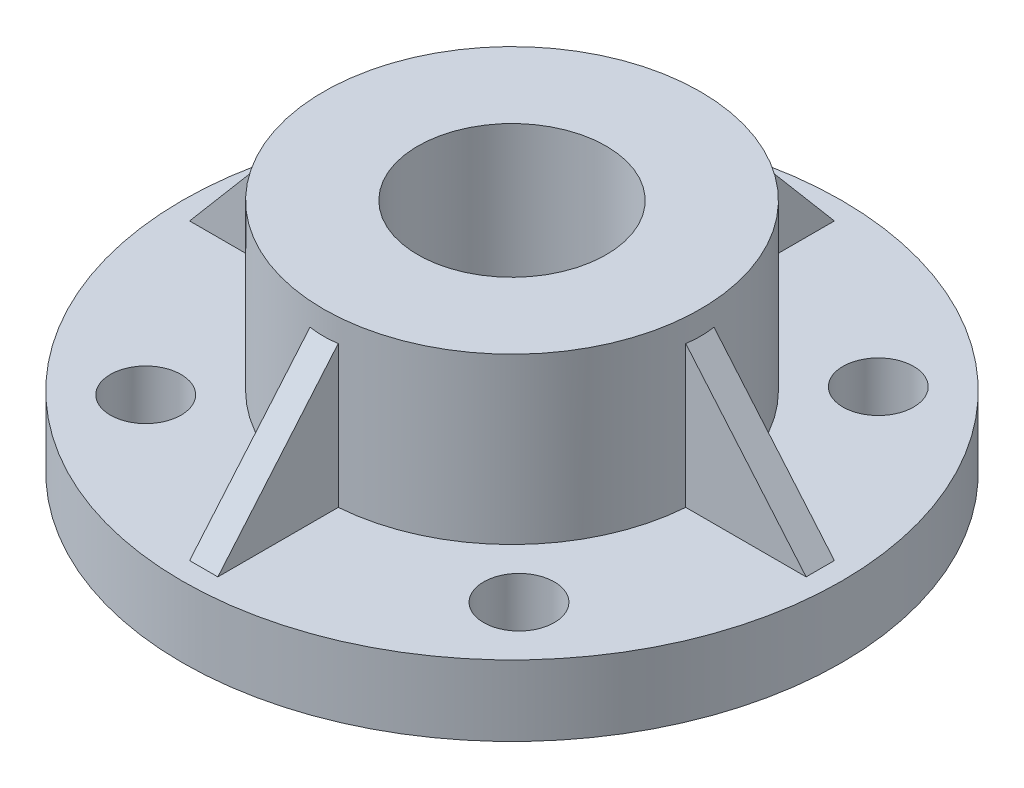
ISO-10303-21;
HEADER;
FILE_DESCRIPTION(('STEP AP214'),'2;1');
FILE_NAME('part.step','',(''),(''),'','','');
FILE_SCHEMA(('AUTOMOTIVE_DESIGN { 1 0 10303 214 1 1 1 1 }'));
ENDSEC;
DATA;
#1=APPLICATION_CONTEXT('core data for automotive mechanical design processes');
#2=APPLICATION_PROTOCOL_DEFINITION('international standard','automotive_design',2000,#1);
#3=PRODUCT_CONTEXT('',#1,'mechanical');
#4=PRODUCT('Part','Part','',(#3));
#5=PRODUCT_RELATED_PRODUCT_CATEGORY('part','',(#4));
#6=PRODUCT_DEFINITION_FORMATION('','',#4);
#7=PRODUCT_DEFINITION_CONTEXT('part definition',#1,'design');
#8=PRODUCT_DEFINITION('design','',#6,#7);
#9=PRODUCT_DEFINITION_SHAPE('','',#8);
#10=(LENGTH_UNIT() NAMED_UNIT(*) SI_UNIT(.MILLI.,.METRE.));
#11=(NAMED_UNIT(*) PLANE_ANGLE_UNIT() SI_UNIT($,.RADIAN.));
#12=(NAMED_UNIT(*) SI_UNIT($,.STERADIAN.) SOLID_ANGLE_UNIT());
#13=UNCERTAINTY_MEASURE_WITH_UNIT(LENGTH_MEASURE(1.E-05),#10,'distance_accuracy_value','');
#14=(GEOMETRIC_REPRESENTATION_CONTEXT(3) GLOBAL_UNCERTAINTY_ASSIGNED_CONTEXT((#13)) GLOBAL_UNIT_ASSIGNED_CONTEXT((#10,
#11,#12)) REPRESENTATION_CONTEXT('',''));
#15=CARTESIAN_POINT('',(0.,0.,0.));
#16=DIRECTION('',(0.,0.,1.));
#17=DIRECTION('',(1.,0.,0.));
#18=AXIS2_PLACEMENT_3D('',#15,#16,#17);
#19=CARTESIAN_POINT('',(20.,49.0897895819615,0.));
#20=DIRECTION('',(0.,1.,0.));
#21=DIRECTION('',(0.,0.,1.));
#22=AXIS2_PLACEMENT_3D('',#19,#20,#21);
#23=PLANE('',#22);
#24=CARTESIAN_POINT('',(0.,49.0897895819615,0.));
#25=DIRECTION('',(0.,-1.,0.));
#26=DIRECTION('',(0.,0.,-1.));
#27=AXIS2_PLACEMENT_3D('',#24,#25,#26);
#28=CIRCLE('',#27,20.);
#29=CARTESIAN_POINT('',(0.,49.0897895819615,-20.));
#30=VERTEX_POINT('',#29);
#31=EDGE_CURVE('E285',#30,#30,#28,.T.);
#32=ORIENTED_EDGE('',*,*,#31,.T.);
#33=EDGE_LOOP('',(#32));
#34=FACE_BOUND('',#33,.T.);
#35=CARTESIAN_POINT('',(0.,49.0897895819615,0.));
#36=DIRECTION('',(0.,-1.,0.));
#37=DIRECTION('',(0.,0.,-1.));
#38=AXIS2_PLACEMENT_3D('',#35,#36,#37);
#39=CIRCLE('',#38,40.);
#40=CARTESIAN_POINT('',(0.,49.0897895819615,-40.));
#41=VERTEX_POINT('',#40);
#42=EDGE_CURVE('E13',#41,#41,#39,.T.);
#43=ORIENTED_EDGE('',*,*,#42,.F.);
#44=EDGE_LOOP('',(#43));
#45=FACE_BOUND('',#44,.T.);
#46=ADVANCED_FACE('F53',(#34,#45),#23,.T.);
#47=CARTESIAN_POINT('',(0.,0.,0.));
#48=DIRECTION('',(0.,-1.,0.));
#49=DIRECTION('',(0.,0.,-1.));
#50=AXIS2_PLACEMENT_3D('',#47,#48,#49);
#51=CYLINDRICAL_SURFACE('',#50,40.);
#52=DIRECTION('',(0.,-1.,0.));
#53=VECTOR('',#52,1.);
#54=CARTESIAN_POINT('',(3.00000000000014,0.,-39.8873413503583));
#55=LINE('',#54,#53);
#56=CARTESIAN_POINT('',(3.00000000000014,14.0897895819615,-39.8873413503583));
#57=VERTEX_POINT('',#56);
#58=CARTESIAN_POINT('',(3.00000000000014,44.2225973757126,-39.8873413503583));
#59=VERTEX_POINT('',#58);
#60=EDGE_CURVE('E221',#57,#59,#55,.F.);
#61=ORIENTED_EDGE('',*,*,#60,.T.);
#62=CARTESIAN_POINT('',(0.,91.2438409303383,0.));
#63=DIRECTION('',(0.,-0.646888134461805,0.762584907726691));
#64=DIRECTION('',(0.,-0.762584907726691,-0.646888134461805));
#65=AXIS2_PLACEMENT_3D('',#62,#63,#64);
#66=ELLIPSE('',#65,61.8344932749138,40.);
#67=CARTESIAN_POINT('',(-2.99999999999986,44.2225973757126,-39.8873413503583));
#68=VERTEX_POINT('',#67);
#69=EDGE_CURVE('E234',#68,#59,#66,.T.);
#70=ORIENTED_EDGE('',*,*,#69,.F.);
#71=DIRECTION('',(0.,-1.,0.));
#72=VECTOR('',#71,1.);
#73=CARTESIAN_POINT('',(-2.99999999999986,0.,-39.8873413503583));
#74=LINE('',#73,#72);
#75=CARTESIAN_POINT('',(-2.99999999999986,14.0897895819615,-39.8873413503583));
#76=VERTEX_POINT('',#75);
#77=EDGE_CURVE('E228',#76,#68,#74,.F.);
#78=ORIENTED_EDGE('',*,*,#77,.F.);
#79=CARTESIAN_POINT('',(0.,14.0897895819615,0.));
#80=DIRECTION('',(0.,-1.,0.));
#81=DIRECTION('',(0.,0.,-1.));
#82=AXIS2_PLACEMENT_3D('',#79,#80,#81);
#83=CIRCLE('',#82,40.);
#84=CARTESIAN_POINT('',(-39.8873413503583,14.0897895819615,-3.));
#85=VERTEX_POINT('',#84);
#86=EDGE_CURVE('E62',#85,#76,#83,.T.);
#87=ORIENTED_EDGE('',*,*,#86,.F.);
#88=DIRECTION('',(0.,-1.,0.));
#89=VECTOR('',#88,1.);
#90=CARTESIAN_POINT('',(-39.8873413503583,0.,-3.));
#91=LINE('',#90,#89);
#92=CARTESIAN_POINT('',(-39.8873413503583,44.2225973757126,-3.));
#93=VERTEX_POINT('',#92);
#94=EDGE_CURVE('E268',#85,#93,#91,.F.);
#95=ORIENTED_EDGE('',*,*,#94,.T.);
#96=CARTESIAN_POINT('',(0.,91.2438409303383,0.));
#97=DIRECTION('',(0.762584907726691,-0.646888134461805,0.));
#98=DIRECTION('',(-0.646888134461805,-0.762584907726691,0.));
#99=AXIS2_PLACEMENT_3D('',#96,#97,#98);
#100=ELLIPSE('',#99,61.8344932749138,40.);
#101=CARTESIAN_POINT('',(-39.8873413503583,44.2225973757126,3.));
#102=VERTEX_POINT('',#101);
#103=EDGE_CURVE('E282',#102,#93,#100,.T.);
#104=ORIENTED_EDGE('',*,*,#103,.F.);
#105=DIRECTION('',(0.,-1.,0.));
#106=VECTOR('',#105,1.);
#107=CARTESIAN_POINT('',(-39.8873413503583,0.,3.));
#108=LINE('',#107,#106);
#109=CARTESIAN_POINT('',(-39.8873413503583,14.0897895819615,3.));
#110=VERTEX_POINT('',#109);
#111=EDGE_CURVE('E276',#110,#102,#108,.F.);
#112=ORIENTED_EDGE('',*,*,#111,.F.);
#113=CARTESIAN_POINT('',(-3.00000000000042,14.0897895819615,39.8873413503583));
#114=VERTEX_POINT('',#113);
#115=EDGE_CURVE('E301',#114,#110,#83,.T.);
#116=ORIENTED_EDGE('',*,*,#115,.F.);
#117=DIRECTION('',(0.,-1.,0.));
#118=VECTOR('',#117,1.);
#119=CARTESIAN_POINT('',(-3.00000000000042,0.,39.8873413503582));
#120=LINE('',#119,#118);
#121=CARTESIAN_POINT('',(-3.00000000000042,44.2225973757126,39.8873413503582));
#122=VERTEX_POINT('',#121);
#123=EDGE_CURVE('E70',#114,#122,#120,.F.);
#124=ORIENTED_EDGE('',*,*,#123,.T.);
#125=CARTESIAN_POINT('',(0.,91.2438409303383,0.));
#126=DIRECTION('',(0.,-0.646888134461805,-0.762584907726691));
#127=DIRECTION('',(0.,-0.762584907726691,0.646888134461805));
#128=AXIS2_PLACEMENT_3D('',#125,#126,#127);
#129=ELLIPSE('',#128,61.8344932749138,40.);
#130=CARTESIAN_POINT('',(2.99999999999958,44.2225973757126,39.8873413503583));
#131=VERTEX_POINT('',#130);
#132=EDGE_CURVE('E156',#131,#122,#129,.T.);
#133=ORIENTED_EDGE('',*,*,#132,.F.);
#134=DIRECTION('',(0.,-1.,0.));
#135=VECTOR('',#134,1.);
#136=CARTESIAN_POINT('',(2.99999999999958,0.,39.8873413503583));
#137=LINE('',#136,#135);
#138=CARTESIAN_POINT('',(2.99999999999959,14.0897895819615,39.8873413503583));
#139=VERTEX_POINT('',#138);
#140=EDGE_CURVE('E162',#139,#131,#137,.F.);
#141=ORIENTED_EDGE('',*,*,#140,.F.);
#142=CARTESIAN_POINT('',(39.8873413503583,14.0897895819615,3.));
#143=VERTEX_POINT('',#142);
#144=EDGE_CURVE('E170',#143,#139,#83,.T.);
#145=ORIENTED_EDGE('',*,*,#144,.F.);
#146=DIRECTION('',(0.,-1.,0.));
#147=VECTOR('',#146,1.);
#148=CARTESIAN_POINT('',(39.8873413503583,0.,3.));
#149=LINE('',#148,#147);
#150=CARTESIAN_POINT('',(39.8873413503583,44.2225973757126,3.));
#151=VERTEX_POINT('',#150);
#152=EDGE_CURVE('E78',#143,#151,#149,.F.);
#153=ORIENTED_EDGE('',*,*,#152,.T.);
#154=CARTESIAN_POINT('',(0.,91.2438409303383,0.));
#155=DIRECTION('',(-0.762584907726691,-0.646888134461805,0.));
#156=DIRECTION('',(0.646888134461805,-0.762584907726691,0.));
#157=AXIS2_PLACEMENT_3D('',#154,#155,#156);
#158=ELLIPSE('',#157,61.8344932749138,40.);
#159=CARTESIAN_POINT('',(39.8873413503583,44.2225973757126,-3.));
#160=VERTEX_POINT('',#159);
#161=EDGE_CURVE('E206',#160,#151,#158,.T.);
#162=ORIENTED_EDGE('',*,*,#161,.F.);
#163=DIRECTION('',(0.,-1.,0.));
#164=VECTOR('',#163,1.);
#165=CARTESIAN_POINT('',(39.8873413503583,0.,-3.));
#166=LINE('',#165,#164);
#167=CARTESIAN_POINT('',(39.8873413503583,14.0897895819615,-3.));
#168=VERTEX_POINT('',#167);
#169=EDGE_CURVE('E195',#168,#160,#166,.F.);
#170=ORIENTED_EDGE('',*,*,#169,.F.);
#171=EDGE_CURVE('E304',#57,#168,#83,.T.);
#172=ORIENTED_EDGE('',*,*,#171,.F.);
#173=EDGE_LOOP('',(#61,#70,#78,#87,#95,#104,#112,#116,#124,#133,#141,#145,#153,#162,#170,#172));
#174=FACE_BOUND('',#173,.T.);
#175=ORIENTED_EDGE('',*,*,#42,.T.);
#176=EDGE_LOOP('',(#175));
#177=FACE_BOUND('',#176,.T.);
#178=ADVANCED_FACE('F348',(#174,#177),#51,.T.);
#179=CARTESIAN_POINT('',(40.,14.0897895819615,0.));
#180=DIRECTION('',(0.,1.,0.));
#181=DIRECTION('',(0.,0.,1.));
#182=AXIS2_PLACEMENT_3D('',#179,#180,#181);
#183=PLANE('',#182);
#184=CARTESIAN_POINT('',(0.,14.0897895819615,0.));
#185=DIRECTION('',(0.,-1.,0.));
#186=DIRECTION('',(0.,0.,-1.));
#187=AXIS2_PLACEMENT_3D('',#184,#185,#186);
#188=CIRCLE('',#187,70.);
#189=CARTESIAN_POINT('',(0.,14.0897895819615,-70.));
#190=VERTEX_POINT('',#189);
#191=EDGE_CURVE('E297',#190,#190,#188,.T.);
#192=ORIENTED_EDGE('',*,*,#191,.F.);
#193=EDGE_LOOP('',(#192));
#194=FACE_BOUND('',#193,.T.);
#195=DIRECTION('',(1.,0.,0.));
#196=VECTOR('',#195,1.);
#197=CARTESIAN_POINT('',(40.0000000000003,14.0897895819615,-65.44850263521));
#198=LINE('',#197,#196);
#199=CARTESIAN_POINT('',(3.00000000000023,14.0897895819615,-65.4485026352101));
#200=VERTEX_POINT('',#199);
#201=CARTESIAN_POINT('',(-2.99999999999977,14.0897895819615,-65.4485026352101));
#202=VERTEX_POINT('',#201);
#203=EDGE_CURVE('E231',#200,#202,#198,.F.);
#204=ORIENTED_EDGE('',*,*,#203,.F.);
#205=DIRECTION('',(0.,0.,1.));
#206=VECTOR('',#205,1.);
#207=CARTESIAN_POINT('',(3.,14.0897895819615,-1.29184809537196E-13));
#208=LINE('',#207,#206);
#209=EDGE_CURVE('E214',#200,#57,#208,.T.);
#210=ORIENTED_EDGE('',*,*,#209,.T.);
#211=ORIENTED_EDGE('',*,*,#171,.T.);
#212=DIRECTION('',(-1.,0.,0.));
#213=VECTOR('',#212,1.);
#214=CARTESIAN_POINT('',(40.,14.0897895819615,-3.));
#215=LINE('',#214,#213);
#216=CARTESIAN_POINT('',(65.4485026352101,14.0897895819615,-3.));
#217=VERTEX_POINT('',#216);
#218=EDGE_CURVE('E190',#217,#168,#215,.T.);
#219=ORIENTED_EDGE('',*,*,#218,.F.);
#220=DIRECTION('',(0.,0.,1.));
#221=VECTOR('',#220,1.);
#222=CARTESIAN_POINT('',(65.4485026352101,14.0897895819615,0.));
#223=LINE('',#222,#221);
#224=CARTESIAN_POINT('',(65.4485026352101,14.0897895819615,3.));
#225=VERTEX_POINT('',#224);
#226=EDGE_CURVE('E203',#225,#217,#223,.F.);
#227=ORIENTED_EDGE('',*,*,#226,.F.);
#228=DIRECTION('',(-1.,0.,0.));
#229=VECTOR('',#228,1.);
#230=CARTESIAN_POINT('',(40.,14.0897895819615,3.));
#231=LINE('',#230,#229);
#232=EDGE_CURVE('E198',#225,#143,#231,.T.);
#233=ORIENTED_EDGE('',*,*,#232,.T.);
#234=ORIENTED_EDGE('',*,*,#144,.T.);
#235=DIRECTION('',(0.,0.,-1.));
#236=VECTOR('',#235,1.);
#237=CARTESIAN_POINT('',(3.,14.0897895819615,-3.87554428611588E-13));
#238=LINE('',#237,#236);
#239=CARTESIAN_POINT('',(2.99999999999932,14.0897895819615,65.4485026352102));
#240=VERTEX_POINT('',#239);
#241=EDGE_CURVE('E160',#240,#139,#238,.T.);
#242=ORIENTED_EDGE('',*,*,#241,.F.);
#243=DIRECTION('',(-1.,0.,0.));
#244=VECTOR('',#243,1.);
#245=CARTESIAN_POINT('',(39.9999999999993,14.0897895819615,65.4485026352106));
#246=LINE('',#245,#244);
#247=CARTESIAN_POINT('',(-3.00000000000069,14.0897895819615,65.4485026352101));
#248=VERTEX_POINT('',#247);
#249=EDGE_CURVE('E147',#248,#240,#246,.F.);
#250=ORIENTED_EDGE('',*,*,#249,.F.);
#251=DIRECTION('',(0.,0.,-1.));
#252=VECTOR('',#251,1.);
#253=CARTESIAN_POINT('',(-3.,14.0897895819615,-4.50401092710764E-13));
#254=LINE('',#253,#252);
#255=EDGE_CURVE('E175',#248,#114,#254,.T.);
#256=ORIENTED_EDGE('',*,*,#255,.T.);
#257=ORIENTED_EDGE('',*,*,#115,.T.);
#258=DIRECTION('',(1.,0.,0.));
#259=VECTOR('',#258,1.);
#260=CARTESIAN_POINT('',(40.,14.0897895819615,3.));
#261=LINE('',#260,#259);
#262=CARTESIAN_POINT('',(-65.4485026352101,14.0897895819615,3.));
#263=VERTEX_POINT('',#262);
#264=EDGE_CURVE('E272',#263,#110,#261,.T.);
#265=ORIENTED_EDGE('',*,*,#264,.F.);
#266=DIRECTION('',(0.,0.,-1.));
#267=VECTOR('',#266,1.);
#268=CARTESIAN_POINT('',(-65.4485026352101,14.0897895819615,0.));
#269=LINE('',#268,#267);
#270=CARTESIAN_POINT('',(-65.4485026352101,14.0897895819615,-3.));
#271=VERTEX_POINT('',#270);
#272=EDGE_CURVE('E279',#271,#263,#269,.F.);
#273=ORIENTED_EDGE('',*,*,#272,.F.);
#274=DIRECTION('',(1.,0.,0.));
#275=VECTOR('',#274,1.);
#276=CARTESIAN_POINT('',(40.,14.0897895819615,-3.));
#277=LINE('',#276,#275);
#278=EDGE_CURVE('E261',#271,#85,#277,.T.);
#279=ORIENTED_EDGE('',*,*,#278,.T.);
#280=ORIENTED_EDGE('',*,*,#86,.T.);
#281=DIRECTION('',(0.,0.,1.));
#282=VECTOR('',#281,1.);
#283=CARTESIAN_POINT('',(-3.,14.0897895819615,-1.50133697570255E-13));
#284=LINE('',#283,#282);
#285=EDGE_CURVE('E225',#202,#76,#284,.T.);
#286=ORIENTED_EDGE('',*,*,#285,.F.);
#287=EDGE_LOOP('',(#204,#210,#211,#219,#227,#233,#234,#242,#250,#256,#257,#265,#273,#279,#280,#286));
#288=FACE_BOUND('',#287,.T.);
#289=CARTESIAN_POINT('',(-38.1409322013991,14.0897895819615,39.626623510063));
#290=DIRECTION('',(0.,1.,0.));
#291=DIRECTION('',(0.,0.,1.));
#292=AXIS2_PLACEMENT_3D('',#289,#290,#291);
#293=CIRCLE('',#292,7.5);
#294=CARTESIAN_POINT('',(-38.1409322013991,14.0897895819615,47.126623510063));
#295=VERTEX_POINT('',#294);
#296=EDGE_CURVE('E252',#295,#295,#293,.T.);
#297=ORIENTED_EDGE('',*,*,#296,.F.);
#298=EDGE_LOOP('',(#297));
#299=FACE_BOUND('',#298,.T.);
#300=CARTESIAN_POINT('',(39.6266235100631,14.0897895819615,38.140932201399));
#301=DIRECTION('',(0.,1.,0.));
#302=DIRECTION('',(0.,0.,1.));
#303=AXIS2_PLACEMENT_3D('',#300,#301,#302);
#304=CIRCLE('',#303,7.50000000000001);
#305=CARTESIAN_POINT('',(39.6266235100631,14.0897895819615,45.640932201399));
#306=VERTEX_POINT('',#305);
#307=EDGE_CURVE('E248',#306,#306,#304,.T.);
#308=ORIENTED_EDGE('',*,*,#307,.F.);
#309=EDGE_LOOP('',(#308));
#310=FACE_BOUND('',#309,.T.);
#311=CARTESIAN_POINT('',(38.1409322013988,14.0897895819615,-39.6266235100633));
#312=DIRECTION('',(0.,1.,0.));
#313=DIRECTION('',(0.,0.,1.));
#314=AXIS2_PLACEMENT_3D('',#311,#312,#313);
#315=CIRCLE('',#314,7.5);
#316=CARTESIAN_POINT('',(38.1409322013988,14.0897895819615,-32.1266235100633));
#317=VERTEX_POINT('',#316);
#318=EDGE_CURVE('E243',#317,#317,#315,.T.);
#319=ORIENTED_EDGE('',*,*,#318,.F.);
#320=EDGE_LOOP('',(#319));
#321=FACE_BOUND('',#320,.T.);
#322=CARTESIAN_POINT('',(-39.6266235100634,14.0897895819615,-38.1409322013987));
#323=DIRECTION('',(0.,1.,0.));
#324=DIRECTION('',(0.,0.,1.));
#325=AXIS2_PLACEMENT_3D('',#322,#323,#324);
#326=CIRCLE('',#325,7.5);
#327=CARTESIAN_POINT('',(-39.6266235100634,14.0897895819615,-30.6409322013987));
#328=VERTEX_POINT('',#327);
#329=EDGE_CURVE('E238',#328,#328,#326,.T.);
#330=ORIENTED_EDGE('',*,*,#329,.F.);
#331=EDGE_LOOP('',(#330));
#332=FACE_BOUND('',#331,.T.);
#333=ADVANCED_FACE('F167',(#194,#288,#299,#310,#321,#332),#183,.T.);
#334=CARTESIAN_POINT('',(0.,0.,0.));
#335=DIRECTION('',(0.,-1.,0.));
#336=DIRECTION('',(0.,0.,-1.));
#337=AXIS2_PLACEMENT_3D('',#334,#335,#336);
#338=CYLINDRICAL_SURFACE('',#337,70.);
#339=CARTESIAN_POINT('',(0.,-0.910210418038515,0.));
#340=DIRECTION('',(0.,-1.,0.));
#341=DIRECTION('',(0.,0.,-1.));
#342=AXIS2_PLACEMENT_3D('',#339,#340,#341);
#343=CIRCLE('',#342,70.);
#344=CARTESIAN_POINT('',(0.,-0.910210418038515,-70.));
#345=VERTEX_POINT('',#344);
#346=EDGE_CURVE('E293',#345,#345,#343,.T.);
#347=ORIENTED_EDGE('',*,*,#346,.F.);
#348=EDGE_LOOP('',(#347));
#349=FACE_BOUND('',#348,.T.);
#350=ORIENTED_EDGE('',*,*,#191,.T.);
#351=EDGE_LOOP('',(#350));
#352=FACE_BOUND('',#351,.T.);
#353=ADVANCED_FACE('F322',(#349,#352),#338,.T.);
#354=CARTESIAN_POINT('',(20.,-0.910210418038515,0.));
#355=DIRECTION('',(0.,-1.,0.));
#356=DIRECTION('',(0.,0.,-1.));
#357=AXIS2_PLACEMENT_3D('',#354,#355,#356);
#358=PLANE('',#357);
#359=CARTESIAN_POINT('',(0.,-0.910210418038515,0.));
#360=DIRECTION('',(0.,-1.,0.));
#361=DIRECTION('',(0.,0.,-1.));
#362=AXIS2_PLACEMENT_3D('',#359,#360,#361);
#363=CIRCLE('',#362,20.);
#364=CARTESIAN_POINT('',(0.,-0.910210418038515,-20.));
#365=VERTEX_POINT('',#364);
#366=EDGE_CURVE('E289',#365,#365,#363,.T.);
#367=ORIENTED_EDGE('',*,*,#366,.F.);
#368=EDGE_LOOP('',(#367));
#369=FACE_BOUND('',#368,.T.);
#370=ORIENTED_EDGE('',*,*,#346,.T.);
#371=EDGE_LOOP('',(#370));
#372=FACE_BOUND('',#371,.T.);
#373=CARTESIAN_POINT('',(38.1409322013988,-0.910210418038515,-39.6266235100633));
#374=DIRECTION('',(0.,-1.,0.));
#375=DIRECTION('',(0.,0.,-1.));
#376=AXIS2_PLACEMENT_3D('',#373,#374,#375);
#377=CIRCLE('',#376,7.5);
#378=CARTESIAN_POINT('',(38.1409322013988,-0.910210418038515,-47.1266235100633));
#379=VERTEX_POINT('',#378);
#380=EDGE_CURVE('E242',#379,#379,#377,.T.);
#381=ORIENTED_EDGE('',*,*,#380,.F.);
#382=EDGE_LOOP('',(#381));
#383=FACE_BOUND('',#382,.T.);
#384=CARTESIAN_POINT('',(39.6266235100631,-0.910210418038515,38.140932201399));
#385=DIRECTION('',(0.,-1.,0.));
#386=DIRECTION('',(0.,0.,-1.));
#387=AXIS2_PLACEMENT_3D('',#384,#385,#386);
#388=CIRCLE('',#387,7.50000000000001);
#389=CARTESIAN_POINT('',(39.6266235100631,-0.910210418038515,30.640932201399));
#390=VERTEX_POINT('',#389);
#391=EDGE_CURVE('E247',#390,#390,#388,.T.);
#392=ORIENTED_EDGE('',*,*,#391,.F.);
#393=EDGE_LOOP('',(#392));
#394=FACE_BOUND('',#393,.T.);
#395=CARTESIAN_POINT('',(-38.1409322013991,-0.910210418038515,39.626623510063));
#396=DIRECTION('',(0.,-1.,0.));
#397=DIRECTION('',(0.,0.,-1.));
#398=AXIS2_PLACEMENT_3D('',#395,#396,#397);
#399=CIRCLE('',#398,7.5);
#400=CARTESIAN_POINT('',(-38.1409322013991,-0.910210418038515,32.126623510063));
#401=VERTEX_POINT('',#400);
#402=EDGE_CURVE('E56',#401,#401,#399,.T.);
#403=ORIENTED_EDGE('',*,*,#402,.F.);
#404=EDGE_LOOP('',(#403));
#405=FACE_BOUND('',#404,.T.);
#406=CARTESIAN_POINT('',(-39.6266235100634,-0.910210418038515,-38.1409322013987));
#407=DIRECTION('',(0.,-1.,0.));
#408=DIRECTION('',(0.,0.,-1.));
#409=AXIS2_PLACEMENT_3D('',#406,#407,#408);
#410=CIRCLE('',#409,7.5);
#411=CARTESIAN_POINT('',(-39.6266235100634,-0.910210418038515,-45.6409322013987));
#412=VERTEX_POINT('',#411);
#413=EDGE_CURVE('E237',#412,#412,#410,.T.);
#414=ORIENTED_EDGE('',*,*,#413,.F.);
#415=EDGE_LOOP('',(#414));
#416=FACE_BOUND('',#415,.T.);
#417=ADVANCED_FACE('F318',(#369,#372,#383,#394,#405,#416),#358,.T.);
#418=CARTESIAN_POINT('',(0.,0.,0.));
#419=DIRECTION('',(0.,-1.,0.));
#420=DIRECTION('',(0.,0.,-1.));
#421=AXIS2_PLACEMENT_3D('',#418,#419,#420);
#422=CYLINDRICAL_SURFACE('',#421,20.);
#423=ORIENTED_EDGE('',*,*,#366,.T.);
#424=EDGE_LOOP('',(#423));
#425=FACE_BOUND('',#424,.T.);
#426=ORIENTED_EDGE('',*,*,#31,.F.);
#427=EDGE_LOOP('',(#426));
#428=FACE_BOUND('',#427,.T.);
#429=ADVANCED_FACE('F321',(#425,#428),#422,.F.);
#430=CARTESIAN_POINT('',(-65.,14.618507489226,0.));
#431=DIRECTION('',(0.762584907726691,-0.646888134461805,0.));
#432=DIRECTION('',(0.646888134461805,0.762584907726691,0.));
#433=AXIS2_PLACEMENT_3D('',#430,#431,#432);
#434=PLANE('',#433);
#435=DIRECTION('',(0.646888134461805,0.762584907726691,0.));
#436=VECTOR('',#435,1.);
#437=CARTESIAN_POINT('',(-65.,14.618507489226,3.));
#438=LINE('',#437,#436);
#439=EDGE_CURVE('E257',#263,#102,#438,.T.);
#440=ORIENTED_EDGE('',*,*,#439,.T.);
#441=ORIENTED_EDGE('',*,*,#103,.T.);
#442=DIRECTION('',(0.646888134461805,0.762584907726691,0.));
#443=VECTOR('',#442,1.);
#444=CARTESIAN_POINT('',(-65.,14.618507489226,-3.));
#445=LINE('',#444,#443);
#446=EDGE_CURVE('E256',#271,#93,#445,.T.);
#447=ORIENTED_EDGE('',*,*,#446,.F.);
#448=ORIENTED_EDGE('',*,*,#272,.T.);
#449=EDGE_LOOP('',(#440,#441,#447,#448));
#450=FACE_BOUND('',#449,.T.);
#451=ADVANCED_FACE('F361',(#450),#434,.F.);
#452=CARTESIAN_POINT('',(0.,24.0897895819615,3.));
#453=DIRECTION('',(0.,0.,1.));
#454=DIRECTION('',(1.,0.,0.));
#455=AXIS2_PLACEMENT_3D('',#452,#453,#454);
#456=PLANE('',#455);
#457=ORIENTED_EDGE('',*,*,#264,.T.);
#458=ORIENTED_EDGE('',*,*,#111,.T.);
#459=ORIENTED_EDGE('',*,*,#439,.F.);
#460=EDGE_LOOP('',(#457,#458,#459));
#461=FACE_BOUND('',#460,.T.);
#462=ADVANCED_FACE('F342',(#461),#456,.T.);
#463=CARTESIAN_POINT('',(0.,24.0897895819615,-3.));
#464=DIRECTION('',(0.,0.,1.));
#465=DIRECTION('',(1.,0.,0.));
#466=AXIS2_PLACEMENT_3D('',#463,#464,#465);
#467=PLANE('',#466);
#468=ORIENTED_EDGE('',*,*,#94,.F.);
#469=ORIENTED_EDGE('',*,*,#278,.F.);
#470=ORIENTED_EDGE('',*,*,#446,.T.);
#471=EDGE_LOOP('',(#468,#469,#470));
#472=FACE_BOUND('',#471,.T.);
#473=ADVANCED_FACE('F333',(#472),#467,.F.);
#474=CARTESIAN_POINT('',(-39.6266235100634,-10.,-38.1409322013987));
#475=DIRECTION('',(0.,1.,0.));
#476=DIRECTION('',(0.,0.,1.));
#477=AXIS2_PLACEMENT_3D('',#474,#475,#476);
#478=CYLINDRICAL_SURFACE('',#477,7.5);
#479=ORIENTED_EDGE('',*,*,#329,.T.);
#480=EDGE_LOOP('',(#479));
#481=FACE_BOUND('',#480,.T.);
#482=ORIENTED_EDGE('',*,*,#413,.T.);
#483=EDGE_LOOP('',(#482));
#484=FACE_BOUND('',#483,.T.);
#485=ADVANCED_FACE('F330',(#481,#484),#478,.F.);
#486=CARTESIAN_POINT('',(38.1409322013988,-10.,-39.6266235100633));
#487=DIRECTION('',(0.,1.,0.));
#488=DIRECTION('',(0.,0.,1.));
#489=AXIS2_PLACEMENT_3D('',#486,#487,#488);
#490=CYLINDRICAL_SURFACE('',#489,7.5);
#491=ORIENTED_EDGE('',*,*,#318,.T.);
#492=EDGE_LOOP('',(#491));
#493=FACE_BOUND('',#492,.T.);
#494=ORIENTED_EDGE('',*,*,#380,.T.);
#495=EDGE_LOOP('',(#494));
#496=FACE_BOUND('',#495,.T.);
#497=ADVANCED_FACE('F332',(#493,#496),#490,.F.);
#498=CARTESIAN_POINT('',(39.6266235100631,-10.,38.140932201399));
#499=DIRECTION('',(0.,1.,0.));
#500=DIRECTION('',(0.,0.,1.));
#501=AXIS2_PLACEMENT_3D('',#498,#499,#500);
#502=CYLINDRICAL_SURFACE('',#501,7.50000000000001);
#503=ORIENTED_EDGE('',*,*,#307,.T.);
#504=EDGE_LOOP('',(#503));
#505=FACE_BOUND('',#504,.T.);
#506=ORIENTED_EDGE('',*,*,#391,.T.);
#507=EDGE_LOOP('',(#506));
#508=FACE_BOUND('',#507,.T.);
#509=ADVANCED_FACE('F316',(#505,#508),#502,.F.);
#510=CARTESIAN_POINT('',(-38.1409322013991,-10.,39.626623510063));
#511=DIRECTION('',(0.,1.,0.));
#512=DIRECTION('',(0.,0.,1.));
#513=AXIS2_PLACEMENT_3D('',#510,#511,#512);
#514=CYLINDRICAL_SURFACE('',#513,7.5);
#515=ORIENTED_EDGE('',*,*,#296,.T.);
#516=EDGE_LOOP('',(#515));
#517=FACE_BOUND('',#516,.T.);
#518=ORIENTED_EDGE('',*,*,#402,.T.);
#519=EDGE_LOOP('',(#518));
#520=FACE_BOUND('',#519,.T.);
#521=ADVANCED_FACE('F436',(#517,#520),#514,.F.);
#522=CARTESIAN_POINT('',(2.26946287024804E-13,14.618507489226,-65.));
#523=DIRECTION('',(0.,-0.646888134461805,0.762584907726691));
#524=DIRECTION('',(0.,0.762584907726691,0.646888134461805));
#525=AXIS2_PLACEMENT_3D('',#522,#523,#524);
#526=PLANE('',#525);
#527=DIRECTION('',(0.,0.762584907726691,0.646888134461805));
#528=VECTOR('',#527,1.);
#529=CARTESIAN_POINT('',(-2.99999999999977,14.618507489226,-65.));
#530=LINE('',#529,#528);
#531=EDGE_CURVE('E210',#202,#68,#530,.T.);
#532=ORIENTED_EDGE('',*,*,#531,.T.);
#533=ORIENTED_EDGE('',*,*,#69,.T.);
#534=DIRECTION('',(0.,0.762584907726691,0.646888134461805));
#535=VECTOR('',#534,1.);
#536=CARTESIAN_POINT('',(3.00000000000023,14.618507489226,-65.));
#537=LINE('',#536,#535);
#538=EDGE_CURVE('E209',#200,#59,#537,.T.);
#539=ORIENTED_EDGE('',*,*,#538,.F.);
#540=ORIENTED_EDGE('',*,*,#203,.T.);
#541=EDGE_LOOP('',(#532,#533,#539,#540));
#542=FACE_BOUND('',#541,.T.);
#543=ADVANCED_FACE('F445',(#542),#526,.F.);
#544=CARTESIAN_POINT('',(-3.,24.0897895819615,0.));
#545=DIRECTION('',(-1.,0.,0.));
#546=DIRECTION('',(0.,0.,1.));
#547=AXIS2_PLACEMENT_3D('',#544,#545,#546);
#548=PLANE('',#547);
#549=ORIENTED_EDGE('',*,*,#285,.T.);
#550=ORIENTED_EDGE('',*,*,#77,.T.);
#551=ORIENTED_EDGE('',*,*,#531,.F.);
#552=EDGE_LOOP('',(#549,#550,#551));
#553=FACE_BOUND('',#552,.T.);
#554=ADVANCED_FACE('F453',(#553),#548,.T.);
#555=CARTESIAN_POINT('',(3.,24.0897895819615,0.));
#556=DIRECTION('',(-1.,0.,0.));
#557=DIRECTION('',(0.,0.,1.));
#558=AXIS2_PLACEMENT_3D('',#555,#556,#557);
#559=PLANE('',#558);
#560=ORIENTED_EDGE('',*,*,#60,.F.);
#561=ORIENTED_EDGE('',*,*,#209,.F.);
#562=ORIENTED_EDGE('',*,*,#538,.T.);
#563=EDGE_LOOP('',(#560,#561,#562));
#564=FACE_BOUND('',#563,.T.);
#565=ADVANCED_FACE('F463',(#564),#559,.F.);
#566=CARTESIAN_POINT('',(65.,14.618507489226,0.));
#567=DIRECTION('',(-0.762584907726691,-0.646888134461805,0.));
#568=DIRECTION('',(-0.646888134461805,0.762584907726691,0.));
#569=AXIS2_PLACEMENT_3D('',#566,#567,#568);
#570=PLANE('',#569);
#571=DIRECTION('',(-0.646888134461805,0.762584907726691,0.));
#572=VECTOR('',#571,1.);
#573=CARTESIAN_POINT('',(65.,14.618507489226,-3.));
#574=LINE('',#573,#572);
#575=EDGE_CURVE('E186',#217,#160,#574,.T.);
#576=ORIENTED_EDGE('',*,*,#575,.T.);
#577=ORIENTED_EDGE('',*,*,#161,.T.);
#578=DIRECTION('',(-0.646888134461805,0.762584907726691,0.));
#579=VECTOR('',#578,1.);
#580=CARTESIAN_POINT('',(65.,14.618507489226,3.));
#581=LINE('',#580,#579);
#582=EDGE_CURVE('E185',#225,#151,#581,.T.);
#583=ORIENTED_EDGE('',*,*,#582,.F.);
#584=ORIENTED_EDGE('',*,*,#226,.T.);
#585=EDGE_LOOP('',(#576,#577,#583,#584));
#586=FACE_BOUND('',#585,.T.);
#587=ADVANCED_FACE('F473',(#586),#570,.F.);
#588=CARTESIAN_POINT('',(0.,24.0897895819615,3.));
#589=DIRECTION('',(0.,0.,-1.));
#590=DIRECTION('',(-1.,0.,0.));
#591=AXIS2_PLACEMENT_3D('',#588,#589,#590);
#592=PLANE('',#591);
#593=ORIENTED_EDGE('',*,*,#152,.F.);
#594=ORIENTED_EDGE('',*,*,#232,.F.);
#595=ORIENTED_EDGE('',*,*,#582,.T.);
#596=EDGE_LOOP('',(#593,#594,#595));
#597=FACE_BOUND('',#596,.T.);
#598=ADVANCED_FACE('F483',(#597),#592,.F.);
#599=CARTESIAN_POINT('',(0.,24.0897895819615,-3.));
#600=DIRECTION('',(0.,0.,-1.));
#601=DIRECTION('',(-1.,0.,0.));
#602=AXIS2_PLACEMENT_3D('',#599,#600,#601);
#603=PLANE('',#602);
#604=ORIENTED_EDGE('',*,*,#218,.T.);
#605=ORIENTED_EDGE('',*,*,#169,.T.);
#606=ORIENTED_EDGE('',*,*,#575,.F.);
#607=EDGE_LOOP('',(#604,#605,#606));
#608=FACE_BOUND('',#607,.T.);
#609=ADVANCED_FACE('F493',(#608),#603,.T.);
#610=CARTESIAN_POINT('',(-6.80838861074411E-13,14.618507489226,65.));
#611=DIRECTION('',(0.,-0.646888134461805,-0.762584907726691));
#612=DIRECTION('',(0.,0.762584907726691,-0.646888134461805));
#613=AXIS2_PLACEMENT_3D('',#610,#611,#612);
#614=PLANE('',#613);
#615=DIRECTION('',(0.,0.762584907726691,-0.646888134461805));
#616=VECTOR('',#615,1.);
#617=CARTESIAN_POINT('',(2.99999999999932,14.618507489226,65.0000000000001));
#618=LINE('',#617,#616);
#619=EDGE_CURVE('E150',#240,#131,#618,.T.);
#620=ORIENTED_EDGE('',*,*,#619,.T.);
#621=ORIENTED_EDGE('',*,*,#132,.T.);
#622=DIRECTION('',(0.,0.762584907726691,-0.646888134461805));
#623=VECTOR('',#622,1.);
#624=CARTESIAN_POINT('',(-3.00000000000068,14.618507489226,65.));
#625=LINE('',#624,#623);
#626=EDGE_CURVE('E152',#248,#122,#625,.T.);
#627=ORIENTED_EDGE('',*,*,#626,.F.);
#628=ORIENTED_EDGE('',*,*,#249,.T.);
#629=EDGE_LOOP('',(#620,#621,#627,#628));
#630=FACE_BOUND('',#629,.T.);
#631=ADVANCED_FACE('F149',(#630),#614,.F.);
#632=CARTESIAN_POINT('',(-3.,24.0897895819615,0.));
#633=DIRECTION('',(1.,0.,0.));
#634=DIRECTION('',(0.,0.,-1.));
#635=AXIS2_PLACEMENT_3D('',#632,#633,#634);
#636=PLANE('',#635);
#637=ORIENTED_EDGE('',*,*,#123,.F.);
#638=ORIENTED_EDGE('',*,*,#255,.F.);
#639=ORIENTED_EDGE('',*,*,#626,.T.);
#640=EDGE_LOOP('',(#637,#638,#639));
#641=FACE_BOUND('',#640,.T.);
#642=ADVANCED_FACE('F511',(#641),#636,.F.);
#643=CARTESIAN_POINT('',(3.,24.0897895819615,0.));
#644=DIRECTION('',(1.,0.,0.));
#645=DIRECTION('',(0.,0.,-1.));
#646=AXIS2_PLACEMENT_3D('',#643,#644,#645);
#647=PLANE('',#646);
#648=ORIENTED_EDGE('',*,*,#241,.T.);
#649=ORIENTED_EDGE('',*,*,#140,.T.);
#650=ORIENTED_EDGE('',*,*,#619,.F.);
#651=EDGE_LOOP('',(#648,#649,#650));
#652=FACE_BOUND('',#651,.T.);
#653=ADVANCED_FACE('F159',(#652),#647,.T.);
#654=CLOSED_SHELL('',(#46,#178,#333,#353,#417,#429,#451,#462,#473,#485,#497,#509,#521,#543,#554,
#565,#587,#598,#609,#631,#642,#653));
#655=MANIFOLD_SOLID_BREP('B2',#654);
#656=ADVANCED_BREP_SHAPE_REPRESENTATION('',(#18,#655),#14);
#657=SHAPE_DEFINITION_REPRESENTATION(#9,#656);
ENDSEC;
END-ISO-10303-21;
